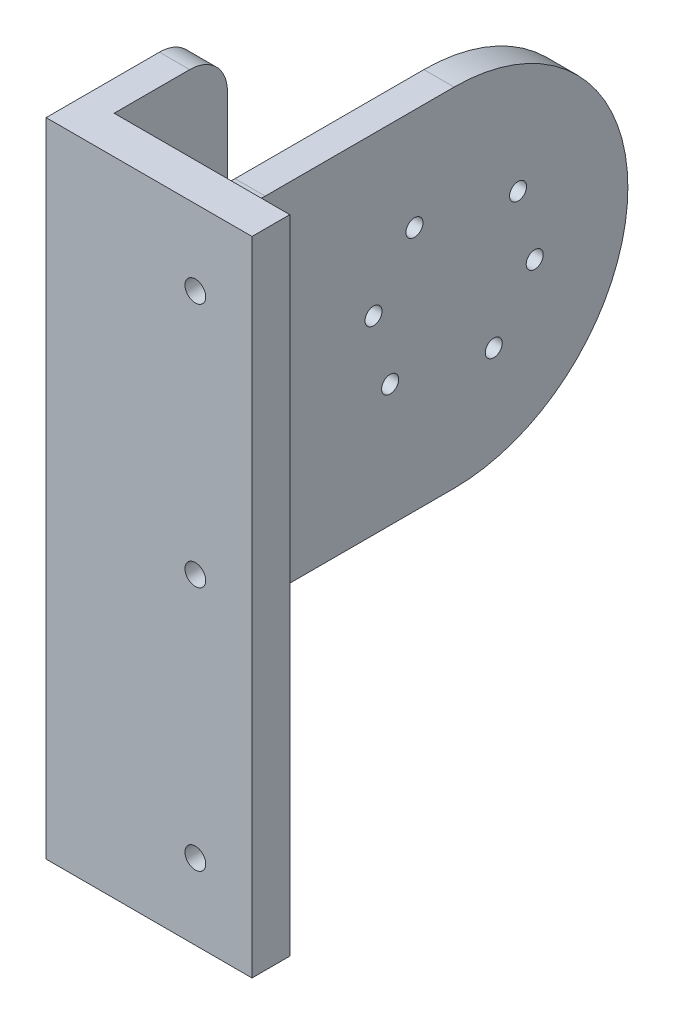
ISO-10303-21;
HEADER;
FILE_DESCRIPTION(('STEP AP214'),'2;1');
FILE_NAME('part.step','',(''),(''),'','','');
FILE_SCHEMA(('AUTOMOTIVE_DESIGN { 1 0 10303 214 1 1 1 1 }'));
ENDSEC;
DATA;
#1=APPLICATION_CONTEXT('core data for automotive mechanical design processes');
#2=APPLICATION_PROTOCOL_DEFINITION('international standard','automotive_design',2000,#1);
#3=PRODUCT_CONTEXT('',#1,'mechanical');
#4=PRODUCT('Part','Part','',(#3));
#5=PRODUCT_RELATED_PRODUCT_CATEGORY('part','',(#4));
#6=PRODUCT_DEFINITION_FORMATION('','',#4);
#7=PRODUCT_DEFINITION_CONTEXT('part definition',#1,'design');
#8=PRODUCT_DEFINITION('design','',#6,#7);
#9=PRODUCT_DEFINITION_SHAPE('','',#8);
#10=(LENGTH_UNIT() NAMED_UNIT(*) SI_UNIT(.MILLI.,.METRE.));
#11=(NAMED_UNIT(*) PLANE_ANGLE_UNIT() SI_UNIT($,.RADIAN.));
#12=(NAMED_UNIT(*) SI_UNIT($,.STERADIAN.) SOLID_ANGLE_UNIT());
#13=UNCERTAINTY_MEASURE_WITH_UNIT(LENGTH_MEASURE(1.E-05),#10,'distance_accuracy_value','');
#14=(GEOMETRIC_REPRESENTATION_CONTEXT(3) GLOBAL_UNCERTAINTY_ASSIGNED_CONTEXT((#13)) GLOBAL_UNIT_ASSIGNED_CONTEXT((#10,
#11,#12)) REPRESENTATION_CONTEXT('',''));
#15=CARTESIAN_POINT('',(0.,0.,0.));
#16=DIRECTION('',(0.,0.,1.));
#17=DIRECTION('',(1.,0.,0.));
#18=AXIS2_PLACEMENT_3D('',#15,#16,#17);
#19=CARTESIAN_POINT('',(7.99999999999997,170.,-10.));
#20=DIRECTION('',(-1.,0.,0.));
#21=DIRECTION('',(0.,0.,-1.));
#22=AXIS2_PLACEMENT_3D('',#19,#20,#21);
#23=PLANE('',#22);
#24=CARTESIAN_POINT('',(7.99999999999997,65.9513128427478,-110.498095902836));
#25=DIRECTION('',(1.,0.,0.));
#26=DIRECTION('',(0.,0.,-1.));
#27=AXIS2_PLACEMENT_3D('',#24,#25,#26);
#28=CIRCLE('',#27,2.25);
#29=CARTESIAN_POINT('',(7.99999999999997,65.9513128427478,-112.748095902836));
#30=VERTEX_POINT('',#29);
#31=EDGE_CURVE('E371',#30,#30,#28,.T.);
#32=ORIENTED_EDGE('',*,*,#31,.F.);
#33=EDGE_LOOP('',(#32));
#34=FACE_BOUND('',#33,.T.);
#35=CARTESIAN_POINT('',(7.99999999999997,98.6463760487826,-116.936319574666));
#36=DIRECTION('',(1.,0.,0.));
#37=DIRECTION('',(0.,0.,-1.));
#38=AXIS2_PLACEMENT_3D('',#35,#36,#37);
#39=CIRCLE('',#38,2.25);
#40=CARTESIAN_POINT('',(7.99999999999997,98.6463760487826,-119.186319574666));
#41=VERTEX_POINT('',#40);
#42=EDGE_CURVE('E375',#41,#41,#39,.T.);
#43=ORIENTED_EDGE('',*,*,#42,.F.);
#44=EDGE_LOOP('',(#43));
#45=FACE_BOUND('',#44,.T.);
#46=CARTESIAN_POINT('',(7.99999999999997,89.2022520557794,-78.6598130828313));
#47=DIRECTION('',(1.,0.,0.));
#48=DIRECTION('',(0.,0.,-1.));
#49=AXIS2_PLACEMENT_3D('',#46,#47,#48);
#50=CIRCLE('',#49,2.25);
#51=CARTESIAN_POINT('',(7.99999999999997,89.2022520557794,-80.9098130828313));
#52=VERTEX_POINT('',#51);
#53=EDGE_CURVE('E382',#52,#52,#50,.T.);
#54=ORIENTED_EDGE('',*,*,#53,.F.);
#55=EDGE_LOOP('',(#54));
#56=FACE_BOUND('',#55,.T.);
#57=CARTESIAN_POINT('',(7.99999999999997,104.048687157252,-89.5019040971644));
#58=DIRECTION('',(1.,0.,0.));
#59=DIRECTION('',(0.,0.,-1.));
#60=AXIS2_PLACEMENT_3D('',#57,#58,#59);
#61=CIRCLE('',#60,2.25);
#62=CARTESIAN_POINT('',(7.99999999999997,104.048687157252,-91.7519040971644));
#63=VERTEX_POINT('',#62);
#64=EDGE_CURVE('E385',#63,#63,#61,.T.);
#65=ORIENTED_EDGE('',*,*,#64,.F.);
#66=EDGE_LOOP('',(#65));
#67=FACE_BOUND('',#66,.T.);
#68=CARTESIAN_POINT('',(7.99999999999997,71.3536239512173,-83.0636804253341));
#69=DIRECTION('',(1.,0.,0.));
#70=DIRECTION('',(0.,0.,-1.));
#71=AXIS2_PLACEMENT_3D('',#68,#69,#70);
#72=CIRCLE('',#71,2.25);
#73=CARTESIAN_POINT('',(7.99999999999997,71.3536239512173,-85.3136804253341));
#74=VERTEX_POINT('',#73);
#75=EDGE_CURVE('E388',#74,#74,#72,.T.);
#76=ORIENTED_EDGE('',*,*,#75,.F.);
#77=EDGE_LOOP('',(#76));
#78=FACE_BOUND('',#77,.T.);
#79=CARTESIAN_POINT('',(7.99999999999997,80.7977479442206,-121.340186917169));
#80=DIRECTION('',(1.,0.,0.));
#81=DIRECTION('',(0.,0.,-1.));
#82=AXIS2_PLACEMENT_3D('',#79,#80,#81);
#83=CIRCLE('',#82,2.25000000000001);
#84=CARTESIAN_POINT('',(7.99999999999997,80.7977479442206,-123.590186917169));
#85=VERTEX_POINT('',#84);
#86=EDGE_CURVE('E391',#85,#85,#83,.T.);
#87=ORIENTED_EDGE('',*,*,#86,.F.);
#88=EDGE_LOOP('',(#87));
#89=FACE_BOUND('',#88,.T.);
#90=DIRECTION('',(0.,1.,0.));
#91=VECTOR('',#90,1.);
#92=CARTESIAN_POINT('',(7.99999999999997,39.,-40.));
#93=LINE('',#92,#91);
#94=CARTESIAN_POINT('',(7.99999999999997,10.,-40.));
#95=VERTEX_POINT('',#94);
#96=CARTESIAN_POINT('',(7.99999999999997,29.,-40.));
#97=VERTEX_POINT('',#96);
#98=EDGE_CURVE('E175',#95,#97,#93,.T.);
#99=ORIENTED_EDGE('',*,*,#98,.T.);
#100=CARTESIAN_POINT('',(7.99999999999998,29.,-50.));
#101=DIRECTION('',(1.,0.,0.));
#102=DIRECTION('',(0.,0.,-1.));
#103=AXIS2_PLACEMENT_3D('',#100,#101,#102);
#104=CIRCLE('',#103,10.);
#105=CARTESIAN_POINT('',(7.99999999999997,39.,-50.));
#106=VERTEX_POINT('',#105);
#107=EDGE_CURVE('E250',#106,#97,#104,.T.);
#108=ORIENTED_EDGE('',*,*,#107,.F.);
#109=DIRECTION('',(0.,0.,-1.));
#110=VECTOR('',#109,1.);
#111=CARTESIAN_POINT('',(7.99999999999998,39.,-100.));
#112=LINE('',#111,#110);
#113=CARTESIAN_POINT('',(7.99999999999998,39.,-100.));
#114=VERTEX_POINT('',#113);
#115=EDGE_CURVE('E178',#106,#114,#112,.T.);
#116=ORIENTED_EDGE('',*,*,#115,.T.);
#117=CARTESIAN_POINT('',(7.99999999999998,85.,-100.));
#118=DIRECTION('',(1.,0.,0.));
#119=DIRECTION('',(0.,0.,1.));
#120=AXIS2_PLACEMENT_3D('',#117,#118,#119);
#121=CIRCLE('',#120,46.);
#122=CARTESIAN_POINT('',(7.99999999999998,131.,-100.));
#123=VERTEX_POINT('',#122);
#124=EDGE_CURVE('E180',#114,#123,#121,.T.);
#125=ORIENTED_EDGE('',*,*,#124,.T.);
#126=DIRECTION('',(0.,0.,1.));
#127=VECTOR('',#126,1.);
#128=CARTESIAN_POINT('',(7.99999999999998,131.,-100.));
#129=LINE('',#128,#127);
#130=CARTESIAN_POINT('',(7.99999999999997,131.,-50.));
#131=VERTEX_POINT('',#130);
#132=EDGE_CURVE('E176',#123,#131,#129,.T.);
#133=ORIENTED_EDGE('',*,*,#132,.T.);
#134=CARTESIAN_POINT('',(7.99999999999998,141.,-50.));
#135=DIRECTION('',(1.,0.,0.));
#136=DIRECTION('',(0.,0.,-1.));
#137=AXIS2_PLACEMENT_3D('',#134,#135,#136);
#138=CIRCLE('',#137,10.);
#139=CARTESIAN_POINT('',(7.99999999999997,141.,-40.));
#140=VERTEX_POINT('',#139);
#141=EDGE_CURVE('E47',#140,#131,#138,.T.);
#142=ORIENTED_EDGE('',*,*,#141,.F.);
#143=DIRECTION('',(0.,1.,0.));
#144=VECTOR('',#143,1.);
#145=CARTESIAN_POINT('',(7.99999999999997,131.,-40.));
#146=LINE('',#145,#144);
#147=CARTESIAN_POINT('',(7.99999999999997,160.,-40.));
#148=VERTEX_POINT('',#147);
#149=EDGE_CURVE('E153',#140,#148,#146,.T.);
#150=ORIENTED_EDGE('',*,*,#149,.T.);
#151=CARTESIAN_POINT('',(7.99999999999998,160.,-30.));
#152=DIRECTION('',(1.,0.,0.));
#153=DIRECTION('',(0.,0.,-1.));
#154=AXIS2_PLACEMENT_3D('',#151,#152,#153);
#155=CIRCLE('',#154,10.);
#156=CARTESIAN_POINT('',(7.99999999999997,170.,-30.));
#157=VERTEX_POINT('',#156);
#158=EDGE_CURVE('E164',#157,#148,#155,.F.);
#159=ORIENTED_EDGE('',*,*,#158,.F.);
#160=DIRECTION('',(0.,0.,1.));
#161=VECTOR('',#160,1.);
#162=CARTESIAN_POINT('',(7.99999999999997,170.,-10.));
#163=LINE('',#162,#161);
#164=CARTESIAN_POINT('',(7.99999999999997,170.,-10.));
#165=VERTEX_POINT('',#164);
#166=EDGE_CURVE('E211',#157,#165,#163,.T.);
#167=ORIENTED_EDGE('',*,*,#166,.T.);
#168=DIRECTION('',(0.,-1.,0.));
#169=VECTOR('',#168,1.);
#170=CARTESIAN_POINT('',(7.99999999999997,0.,-10.));
#171=LINE('',#170,#169);
#172=CARTESIAN_POINT('',(7.99999999999997,0.,-10.));
#173=VERTEX_POINT('',#172);
#174=EDGE_CURVE('E233',#165,#173,#171,.T.);
#175=ORIENTED_EDGE('',*,*,#174,.T.);
#176=DIRECTION('',(0.,0.,1.));
#177=VECTOR('',#176,1.);
#178=CARTESIAN_POINT('',(7.99999999999997,0.,-10.));
#179=LINE('',#178,#177);
#180=CARTESIAN_POINT('',(7.99999999999997,0.,-30.));
#181=VERTEX_POINT('',#180);
#182=EDGE_CURVE('E208',#181,#173,#179,.T.);
#183=ORIENTED_EDGE('',*,*,#182,.F.);
#184=CARTESIAN_POINT('',(7.99999999999997,10.,-30.));
#185=DIRECTION('',(1.,0.,0.));
#186=DIRECTION('',(0.,0.,-1.));
#187=AXIS2_PLACEMENT_3D('',#184,#185,#186);
#188=CIRCLE('',#187,10.);
#189=EDGE_CURVE('E169',#95,#181,#188,.F.);
#190=ORIENTED_EDGE('',*,*,#189,.F.);
#191=EDGE_LOOP('',(#99,#108,#116,#125,#133,#142,#150,#159,#167,#175,#183,#190));
#192=FACE_BOUND('',#191,.T.);
#193=ADVANCED_FACE('F37',(#34,#45,#56,#67,#78,#89,#192),#23,.F.);
#194=CARTESIAN_POINT('',(0.,170.,0.));
#195=DIRECTION('',(0.,0.,-1.));
#196=DIRECTION('',(1.,0.,0.));
#197=AXIS2_PLACEMENT_3D('',#194,#195,#196);
#198=PLANE('',#197);
#199=CARTESIAN_POINT('',(39.5,150.,0.));
#200=DIRECTION('',(0.,0.,-1.));
#201=DIRECTION('',(-1.,0.,0.));
#202=AXIS2_PLACEMENT_3D('',#199,#200,#201);
#203=CIRCLE('',#202,2.75000000000001);
#204=CARTESIAN_POINT('',(36.75,150.,0.));
#205=VERTEX_POINT('',#204);
#206=EDGE_CURVE('E227',#205,#205,#203,.T.);
#207=ORIENTED_EDGE('',*,*,#206,.T.);
#208=EDGE_LOOP('',(#207));
#209=FACE_BOUND('',#208,.T.);
#210=CARTESIAN_POINT('',(39.5,20.,0.));
#211=DIRECTION('',(0.,0.,-1.));
#212=DIRECTION('',(-1.,0.,0.));
#213=AXIS2_PLACEMENT_3D('',#210,#211,#212);
#214=CIRCLE('',#213,2.75000000000001);
#215=CARTESIAN_POINT('',(36.75,20.,0.));
#216=VERTEX_POINT('',#215);
#217=EDGE_CURVE('E370',#216,#216,#214,.T.);
#218=ORIENTED_EDGE('',*,*,#217,.T.);
#219=EDGE_LOOP('',(#218));
#220=FACE_BOUND('',#219,.T.);
#221=CARTESIAN_POINT('',(39.5,85.,0.));
#222=DIRECTION('',(0.,0.,-1.));
#223=DIRECTION('',(-1.,0.,0.));
#224=AXIS2_PLACEMENT_3D('',#221,#222,#223);
#225=CIRCLE('',#224,2.75000000000001);
#226=CARTESIAN_POINT('',(36.75,85.,0.));
#227=VERTEX_POINT('',#226);
#228=EDGE_CURVE('E366',#227,#227,#225,.T.);
#229=ORIENTED_EDGE('',*,*,#228,.T.);
#230=EDGE_LOOP('',(#229));
#231=FACE_BOUND('',#230,.T.);
#232=DIRECTION('',(-1.,0.,0.));
#233=VECTOR('',#232,1.);
#234=CARTESIAN_POINT('',(0.,0.,0.));
#235=LINE('',#234,#233);
#236=CARTESIAN_POINT('',(54.5,0.,0.));
#237=VERTEX_POINT('',#236);
#238=CARTESIAN_POINT('',(0.,0.,0.));
#239=VERTEX_POINT('',#238);
#240=EDGE_CURVE('E203',#237,#239,#235,.T.);
#241=ORIENTED_EDGE('',*,*,#240,.F.);
#242=DIRECTION('',(0.,1.,0.));
#243=VECTOR('',#242,1.);
#244=CARTESIAN_POINT('',(54.5,170.,0.));
#245=LINE('',#244,#243);
#246=CARTESIAN_POINT('',(54.5,170.,0.));
#247=VERTEX_POINT('',#246);
#248=EDGE_CURVE('E255',#237,#247,#245,.T.);
#249=ORIENTED_EDGE('',*,*,#248,.T.);
#250=DIRECTION('',(-1.,0.,0.));
#251=VECTOR('',#250,1.);
#252=CARTESIAN_POINT('',(0.,170.,0.));
#253=LINE('',#252,#251);
#254=CARTESIAN_POINT('',(0.,170.,0.));
#255=VERTEX_POINT('',#254);
#256=EDGE_CURVE('E204',#247,#255,#253,.T.);
#257=ORIENTED_EDGE('',*,*,#256,.T.);
#258=DIRECTION('',(0.,-1.,0.));
#259=VECTOR('',#258,1.);
#260=CARTESIAN_POINT('',(0.,170.,0.));
#261=LINE('',#260,#259);
#262=EDGE_CURVE('E213',#255,#239,#261,.T.);
#263=ORIENTED_EDGE('',*,*,#262,.T.);
#264=EDGE_LOOP('',(#241,#249,#257,#263));
#265=FACE_BOUND('',#264,.T.);
#266=ADVANCED_FACE('F265',(#209,#220,#231,#265),#198,.F.);
#267=CARTESIAN_POINT('',(0.,170.,-300.));
#268=DIRECTION('',(1.,0.,0.));
#269=DIRECTION('',(0.,0.,1.));
#270=AXIS2_PLACEMENT_3D('',#267,#268,#269);
#271=PLANE('',#270);
#272=CARTESIAN_POINT('',(0.,65.9513128427478,-110.498095902836));
#273=DIRECTION('',(1.,0.,0.));
#274=DIRECTION('',(0.,0.,1.));
#275=AXIS2_PLACEMENT_3D('',#272,#273,#274);
#276=CIRCLE('',#275,2.25);
#277=CARTESIAN_POINT('',(0.,65.9513128427478,-108.248095902836));
#278=VERTEX_POINT('',#277);
#279=EDGE_CURVE('E398',#278,#278,#276,.T.);
#280=ORIENTED_EDGE('',*,*,#279,.T.);
#281=EDGE_LOOP('',(#280));
#282=FACE_BOUND('',#281,.T.);
#283=CARTESIAN_POINT('',(0.,98.6463760487826,-116.936319574666));
#284=DIRECTION('',(1.,0.,0.));
#285=DIRECTION('',(0.,0.,-1.));
#286=AXIS2_PLACEMENT_3D('',#283,#284,#285);
#287=CIRCLE('',#286,2.25);
#288=CARTESIAN_POINT('',(0.,98.6463760487826,-119.186319574666));
#289=VERTEX_POINT('',#288);
#290=EDGE_CURVE('E397',#289,#289,#287,.T.);
#291=ORIENTED_EDGE('',*,*,#290,.T.);
#292=EDGE_LOOP('',(#291));
#293=FACE_BOUND('',#292,.T.);
#294=CARTESIAN_POINT('',(0.,89.2022520557794,-78.6598130828313));
#295=DIRECTION('',(1.,0.,0.));
#296=DIRECTION('',(0.,0.,1.));
#297=AXIS2_PLACEMENT_3D('',#294,#295,#296);
#298=CIRCLE('',#297,2.25);
#299=CARTESIAN_POINT('',(0.,89.2022520557794,-76.4098130828313));
#300=VERTEX_POINT('',#299);
#301=EDGE_CURVE('E402',#300,#300,#298,.T.);
#302=ORIENTED_EDGE('',*,*,#301,.T.);
#303=EDGE_LOOP('',(#302));
#304=FACE_BOUND('',#303,.T.);
#305=CARTESIAN_POINT('',(0.,104.048687157252,-89.5019040971644));
#306=DIRECTION('',(1.,0.,0.));
#307=DIRECTION('',(0.,0.,1.));
#308=AXIS2_PLACEMENT_3D('',#305,#306,#307);
#309=CIRCLE('',#308,2.25);
#310=CARTESIAN_POINT('',(0.,104.048687157252,-87.2519040971644));
#311=VERTEX_POINT('',#310);
#312=EDGE_CURVE('E405',#311,#311,#309,.T.);
#313=ORIENTED_EDGE('',*,*,#312,.T.);
#314=EDGE_LOOP('',(#313));
#315=FACE_BOUND('',#314,.T.);
#316=CARTESIAN_POINT('',(0.,71.3536239512173,-83.0636804253341));
#317=DIRECTION('',(1.,0.,0.));
#318=DIRECTION('',(0.,0.,-1.));
#319=AXIS2_PLACEMENT_3D('',#316,#317,#318);
#320=CIRCLE('',#319,2.25);
#321=CARTESIAN_POINT('',(0.,71.3536239512173,-85.3136804253341));
#322=VERTEX_POINT('',#321);
#323=EDGE_CURVE('E401',#322,#322,#320,.T.);
#324=ORIENTED_EDGE('',*,*,#323,.T.);
#325=EDGE_LOOP('',(#324));
#326=FACE_BOUND('',#325,.T.);
#327=CARTESIAN_POINT('',(0.,80.7977479442206,-121.340186917169));
#328=DIRECTION('',(1.,0.,0.));
#329=DIRECTION('',(0.,0.,-1.));
#330=AXIS2_PLACEMENT_3D('',#327,#328,#329);
#331=CIRCLE('',#330,2.25000000000001);
#332=CARTESIAN_POINT('',(0.,80.7977479442206,-123.590186917169));
#333=VERTEX_POINT('',#332);
#334=EDGE_CURVE('E394',#333,#333,#331,.T.);
#335=ORIENTED_EDGE('',*,*,#334,.T.);
#336=EDGE_LOOP('',(#335));
#337=FACE_BOUND('',#336,.T.);
#338=DIRECTION('',(0.,0.,-1.));
#339=VECTOR('',#338,1.);
#340=CARTESIAN_POINT('',(0.,0.,-300.));
#341=LINE('',#340,#339);
#342=CARTESIAN_POINT('',(0.,0.,-30.));
#343=VERTEX_POINT('',#342);
#344=EDGE_CURVE('E216',#239,#343,#341,.T.);
#345=ORIENTED_EDGE('',*,*,#344,.F.);
#346=ORIENTED_EDGE('',*,*,#262,.F.);
#347=DIRECTION('',(0.,0.,-1.));
#348=VECTOR('',#347,1.);
#349=CARTESIAN_POINT('',(0.,170.,-300.));
#350=LINE('',#349,#348);
#351=CARTESIAN_POINT('',(0.,170.,-30.));
#352=VERTEX_POINT('',#351);
#353=EDGE_CURVE('E207',#255,#352,#350,.T.);
#354=ORIENTED_EDGE('',*,*,#353,.T.);
#355=CARTESIAN_POINT('',(0.,160.,-30.));
#356=DIRECTION('',(-1.,0.,0.));
#357=DIRECTION('',(0.,0.,1.));
#358=AXIS2_PLACEMENT_3D('',#355,#356,#357);
#359=CIRCLE('',#358,10.);
#360=CARTESIAN_POINT('',(0.,160.,-40.));
#361=VERTEX_POINT('',#360);
#362=EDGE_CURVE('E235',#361,#352,#359,.F.);
#363=ORIENTED_EDGE('',*,*,#362,.F.);
#364=DIRECTION('',(0.,1.,0.));
#365=VECTOR('',#364,1.);
#366=CARTESIAN_POINT('',(0.,170.,-40.));
#367=LINE('',#366,#365);
#368=CARTESIAN_POINT('',(0.,141.,-40.));
#369=VERTEX_POINT('',#368);
#370=EDGE_CURVE('E156',#369,#361,#367,.T.);
#371=ORIENTED_EDGE('',*,*,#370,.F.);
#372=CARTESIAN_POINT('',(0.,141.,-50.));
#373=DIRECTION('',(-1.,0.,0.));
#374=DIRECTION('',(0.,0.,1.));
#375=AXIS2_PLACEMENT_3D('',#372,#373,#374);
#376=CIRCLE('',#375,10.);
#377=CARTESIAN_POINT('',(0.,131.,-50.));
#378=VERTEX_POINT('',#377);
#379=EDGE_CURVE('E11',#378,#369,#376,.T.);
#380=ORIENTED_EDGE('',*,*,#379,.F.);
#381=DIRECTION('',(0.,0.,1.));
#382=VECTOR('',#381,1.);
#383=CARTESIAN_POINT('',(0.,131.,-300.));
#384=LINE('',#383,#382);
#385=CARTESIAN_POINT('',(0.,131.,-100.));
#386=VERTEX_POINT('',#385);
#387=EDGE_CURVE('E194',#386,#378,#384,.T.);
#388=ORIENTED_EDGE('',*,*,#387,.F.);
#389=CARTESIAN_POINT('',(0.,85.,-100.));
#390=DIRECTION('',(-1.,0.,0.));
#391=DIRECTION('',(0.,0.,1.));
#392=AXIS2_PLACEMENT_3D('',#389,#390,#391);
#393=CIRCLE('',#392,46.);
#394=CARTESIAN_POINT('',(0.,39.,-100.));
#395=VERTEX_POINT('',#394);
#396=EDGE_CURVE('E200',#395,#386,#393,.F.);
#397=ORIENTED_EDGE('',*,*,#396,.F.);
#398=DIRECTION('',(0.,0.,-1.));
#399=VECTOR('',#398,1.);
#400=CARTESIAN_POINT('',(0.,39.,-300.));
#401=LINE('',#400,#399);
#402=CARTESIAN_POINT('',(0.,39.,-50.));
#403=VERTEX_POINT('',#402);
#404=EDGE_CURVE('E197',#403,#395,#401,.T.);
#405=ORIENTED_EDGE('',*,*,#404,.F.);
#406=CARTESIAN_POINT('',(0.,29.,-50.));
#407=DIRECTION('',(-1.,0.,0.));
#408=DIRECTION('',(0.,0.,1.));
#409=AXIS2_PLACEMENT_3D('',#406,#407,#408);
#410=CIRCLE('',#409,10.);
#411=CARTESIAN_POINT('',(0.,29.,-40.));
#412=VERTEX_POINT('',#411);
#413=EDGE_CURVE('E252',#412,#403,#410,.T.);
#414=ORIENTED_EDGE('',*,*,#413,.F.);
#415=DIRECTION('',(0.,1.,0.));
#416=VECTOR('',#415,1.);
#417=CARTESIAN_POINT('',(0.,170.,-40.));
#418=LINE('',#417,#416);
#419=CARTESIAN_POINT('',(0.,10.,-40.));
#420=VERTEX_POINT('',#419);
#421=EDGE_CURVE('E189',#420,#412,#418,.T.);
#422=ORIENTED_EDGE('',*,*,#421,.F.);
#423=CARTESIAN_POINT('',(0.,10.,-30.));
#424=DIRECTION('',(-1.,0.,0.));
#425=DIRECTION('',(0.,0.,1.));
#426=AXIS2_PLACEMENT_3D('',#423,#424,#425);
#427=CIRCLE('',#426,10.);
#428=EDGE_CURVE('E237',#343,#420,#427,.F.);
#429=ORIENTED_EDGE('',*,*,#428,.F.);
#430=EDGE_LOOP('',(#345,#346,#354,#363,#371,#380,#388,#397,#405,#414,#422,#429));
#431=FACE_BOUND('',#430,.T.);
#432=ADVANCED_FACE('F288',(#282,#293,#304,#315,#326,#337,#431),#271,.F.);
#433=CARTESIAN_POINT('',(0.,170.,0.));
#434=DIRECTION('',(0.,1.,0.));
#435=DIRECTION('',(0.,0.,-1.));
#436=AXIS2_PLACEMENT_3D('',#433,#434,#435);
#437=PLANE('',#436);
#438=ORIENTED_EDGE('',*,*,#353,.F.);
#439=ORIENTED_EDGE('',*,*,#256,.F.);
#440=DIRECTION('',(0.,0.,-1.));
#441=VECTOR('',#440,1.);
#442=CARTESIAN_POINT('',(54.5,170.,0.));
#443=LINE('',#442,#441);
#444=CARTESIAN_POINT('',(54.5,170.,-10.));
#445=VERTEX_POINT('',#444);
#446=EDGE_CURVE('E41',#247,#445,#443,.T.);
#447=ORIENTED_EDGE('',*,*,#446,.T.);
#448=DIRECTION('',(-1.,0.,0.));
#449=VECTOR('',#448,1.);
#450=CARTESIAN_POINT('',(64.5,170.,-10.));
#451=LINE('',#450,#449);
#452=EDGE_CURVE('E261',#445,#165,#451,.T.);
#453=ORIENTED_EDGE('',*,*,#452,.T.);
#454=ORIENTED_EDGE('',*,*,#166,.F.);
#455=DIRECTION('',(-1.,0.,0.));
#456=VECTOR('',#455,1.);
#457=CARTESIAN_POINT('',(7.99999999999998,170.,-30.));
#458=LINE('',#457,#456);
#459=EDGE_CURVE('E160',#352,#157,#458,.F.);
#460=ORIENTED_EDGE('',*,*,#459,.F.);
#461=EDGE_LOOP('',(#438,#439,#447,#453,#454,#460));
#462=FACE_BOUND('',#461,.T.);
#463=ADVANCED_FACE('F260',(#462),#437,.T.);
#464=CARTESIAN_POINT('',(0.,0.,0.));
#465=DIRECTION('',(0.,1.,0.));
#466=DIRECTION('',(0.,0.,-1.));
#467=AXIS2_PLACEMENT_3D('',#464,#465,#466);
#468=PLANE('',#467);
#469=ORIENTED_EDGE('',*,*,#182,.T.);
#470=DIRECTION('',(-1.,0.,0.));
#471=VECTOR('',#470,1.);
#472=CARTESIAN_POINT('',(64.5,0.,-10.));
#473=LINE('',#472,#471);
#474=CARTESIAN_POINT('',(54.5,0.,-10.));
#475=VERTEX_POINT('',#474);
#476=EDGE_CURVE('E85',#475,#173,#473,.T.);
#477=ORIENTED_EDGE('',*,*,#476,.F.);
#478=DIRECTION('',(0.,0.,1.));
#479=VECTOR('',#478,1.);
#480=CARTESIAN_POINT('',(54.5,0.,0.));
#481=LINE('',#480,#479);
#482=EDGE_CURVE('E258',#475,#237,#481,.T.);
#483=ORIENTED_EDGE('',*,*,#482,.T.);
#484=ORIENTED_EDGE('',*,*,#240,.T.);
#485=ORIENTED_EDGE('',*,*,#344,.T.);
#486=DIRECTION('',(-1.,0.,0.));
#487=VECTOR('',#486,1.);
#488=CARTESIAN_POINT('',(0.,0.,-30.));
#489=LINE('',#488,#487);
#490=EDGE_CURVE('E222',#181,#343,#489,.T.);
#491=ORIENTED_EDGE('',*,*,#490,.F.);
#492=EDGE_LOOP('',(#469,#477,#483,#484,#485,#491));
#493=FACE_BOUND('',#492,.T.);
#494=ADVANCED_FACE('F267',(#493),#468,.F.);
#495=CARTESIAN_POINT('',(-172.,85.,-100.));
#496=DIRECTION('',(1.,0.,0.));
#497=DIRECTION('',(0.,0.,1.));
#498=AXIS2_PLACEMENT_3D('',#495,#496,#497);
#499=CYLINDRICAL_SURFACE('',#498,46.);
#500=DIRECTION('',(1.,0.,0.));
#501=VECTOR('',#500,1.);
#502=CARTESIAN_POINT('',(-172.,39.,-100.));
#503=LINE('',#502,#501);
#504=EDGE_CURVE('E187',#395,#114,#503,.T.);
#505=ORIENTED_EDGE('',*,*,#504,.F.);
#506=ORIENTED_EDGE('',*,*,#396,.T.);
#507=DIRECTION('',(1.,0.,0.));
#508=VECTOR('',#507,1.);
#509=CARTESIAN_POINT('',(-172.,131.,-100.));
#510=LINE('',#509,#508);
#511=EDGE_CURVE('E186',#386,#123,#510,.T.);
#512=ORIENTED_EDGE('',*,*,#511,.T.);
#513=ORIENTED_EDGE('',*,*,#124,.F.);
#514=EDGE_LOOP('',(#505,#506,#512,#513));
#515=FACE_BOUND('',#514,.T.);
#516=ADVANCED_FACE('F279',(#515),#499,.T.);
#517=CARTESIAN_POINT('',(-172.,39.,-100.));
#518=DIRECTION('',(0.,1.,0.));
#519=DIRECTION('',(0.,0.,-1.));
#520=AXIS2_PLACEMENT_3D('',#517,#518,#519);
#521=PLANE('',#520);
#522=ORIENTED_EDGE('',*,*,#404,.T.);
#523=ORIENTED_EDGE('',*,*,#504,.T.);
#524=ORIENTED_EDGE('',*,*,#115,.F.);
#525=DIRECTION('',(1.,0.,0.));
#526=VECTOR('',#525,1.);
#527=CARTESIAN_POINT('',(7.99999999999998,39.,-50.));
#528=LINE('',#527,#526);
#529=EDGE_CURVE('E56',#403,#106,#528,.T.);
#530=ORIENTED_EDGE('',*,*,#529,.F.);
#531=EDGE_LOOP('',(#522,#523,#524,#530));
#532=FACE_BOUND('',#531,.T.);
#533=ADVANCED_FACE('F546',(#532),#521,.F.);
#534=CARTESIAN_POINT('',(-172.,131.,-100.));
#535=DIRECTION('',(0.,-1.,0.));
#536=DIRECTION('',(0.,0.,1.));
#537=AXIS2_PLACEMENT_3D('',#534,#535,#536);
#538=PLANE('',#537);
#539=ORIENTED_EDGE('',*,*,#132,.F.);
#540=ORIENTED_EDGE('',*,*,#511,.F.);
#541=ORIENTED_EDGE('',*,*,#387,.T.);
#542=DIRECTION('',(1.,0.,0.));
#543=VECTOR('',#542,1.);
#544=CARTESIAN_POINT('',(0.,131.,-50.));
#545=LINE('',#544,#543);
#546=EDGE_CURVE('E248',#131,#378,#545,.F.);
#547=ORIENTED_EDGE('',*,*,#546,.F.);
#548=EDGE_LOOP('',(#539,#540,#541,#547));
#549=FACE_BOUND('',#548,.T.);
#550=ADVANCED_FACE('F283',(#549),#538,.F.);
#551=CARTESIAN_POINT('',(-172.,131.,-40.));
#552=DIRECTION('',(0.,0.,1.));
#553=DIRECTION('',(0.,1.,0.));
#554=AXIS2_PLACEMENT_3D('',#551,#552,#553);
#555=PLANE('',#554);
#556=ORIENTED_EDGE('',*,*,#149,.F.);
#557=DIRECTION('',(1.,0.,0.));
#558=VECTOR('',#557,1.);
#559=CARTESIAN_POINT('',(7.99999999999998,141.,-40.));
#560=LINE('',#559,#558);
#561=EDGE_CURVE('E161',#369,#140,#560,.T.);
#562=ORIENTED_EDGE('',*,*,#561,.F.);
#563=ORIENTED_EDGE('',*,*,#370,.T.);
#564=DIRECTION('',(-1.,0.,0.));
#565=VECTOR('',#564,1.);
#566=CARTESIAN_POINT('',(0.,160.,-40.));
#567=LINE('',#566,#565);
#568=EDGE_CURVE('E149',#148,#361,#567,.T.);
#569=ORIENTED_EDGE('',*,*,#568,.F.);
#570=EDGE_LOOP('',(#556,#562,#563,#569));
#571=FACE_BOUND('',#570,.T.);
#572=ADVANCED_FACE('F151',(#571),#555,.F.);
#573=CARTESIAN_POINT('',(-172.,39.,-40.));
#574=DIRECTION('',(0.,0.,1.));
#575=DIRECTION('',(0.,1.,0.));
#576=AXIS2_PLACEMENT_3D('',#573,#574,#575);
#577=PLANE('',#576);
#578=ORIENTED_EDGE('',*,*,#421,.T.);
#579=DIRECTION('',(1.,0.,0.));
#580=VECTOR('',#579,1.);
#581=CARTESIAN_POINT('',(0.,29.,-40.));
#582=LINE('',#581,#580);
#583=EDGE_CURVE('E240',#97,#412,#582,.F.);
#584=ORIENTED_EDGE('',*,*,#583,.F.);
#585=ORIENTED_EDGE('',*,*,#98,.F.);
#586=DIRECTION('',(-1.,0.,0.));
#587=VECTOR('',#586,1.);
#588=CARTESIAN_POINT('',(-172.,10.,-40.0000000000001));
#589=LINE('',#588,#587);
#590=EDGE_CURVE('E170',#420,#95,#589,.F.);
#591=ORIENTED_EDGE('',*,*,#590,.F.);
#592=EDGE_LOOP('',(#578,#584,#585,#591));
#593=FACE_BOUND('',#592,.T.);
#594=ADVANCED_FACE('F296',(#593),#577,.F.);
#595=CARTESIAN_POINT('',(64.5,0.,-10.));
#596=DIRECTION('',(0.,0.,1.));
#597=DIRECTION('',(-1.,0.,0.));
#598=AXIS2_PLACEMENT_3D('',#595,#596,#597);
#599=PLANE('',#598);
#600=CARTESIAN_POINT('',(39.5,150.,-10.));
#601=DIRECTION('',(0.,0.,-1.));
#602=DIRECTION('',(-1.,0.,0.));
#603=AXIS2_PLACEMENT_3D('',#600,#601,#602);
#604=CIRCLE('',#603,2.75000000000001);
#605=CARTESIAN_POINT('',(36.75,150.,-10.));
#606=VERTEX_POINT('',#605);
#607=EDGE_CURVE('E230',#606,#606,#604,.T.);
#608=ORIENTED_EDGE('',*,*,#607,.F.);
#609=EDGE_LOOP('',(#608));
#610=FACE_BOUND('',#609,.T.);
#611=CARTESIAN_POINT('',(39.5,20.,-10.));
#612=DIRECTION('',(0.,0.,-1.));
#613=DIRECTION('',(-1.,0.,0.));
#614=AXIS2_PLACEMENT_3D('',#611,#612,#613);
#615=CIRCLE('',#614,2.75000000000001);
#616=CARTESIAN_POINT('',(36.75,20.,-10.));
#617=VERTEX_POINT('',#616);
#618=EDGE_CURVE('E226',#617,#617,#615,.T.);
#619=ORIENTED_EDGE('',*,*,#618,.F.);
#620=EDGE_LOOP('',(#619));
#621=FACE_BOUND('',#620,.T.);
#622=CARTESIAN_POINT('',(39.5,85.,-10.));
#623=DIRECTION('',(0.,0.,-1.));
#624=DIRECTION('',(-1.,0.,0.));
#625=AXIS2_PLACEMENT_3D('',#622,#623,#624);
#626=CIRCLE('',#625,2.75000000000001);
#627=CARTESIAN_POINT('',(36.75,85.,-10.));
#628=VERTEX_POINT('',#627);
#629=EDGE_CURVE('E223',#628,#628,#626,.T.);
#630=ORIENTED_EDGE('',*,*,#629,.F.);
#631=EDGE_LOOP('',(#630));
#632=FACE_BOUND('',#631,.T.);
#633=ORIENTED_EDGE('',*,*,#174,.F.);
#634=ORIENTED_EDGE('',*,*,#452,.F.);
#635=DIRECTION('',(0.,-1.,0.));
#636=VECTOR('',#635,1.);
#637=CARTESIAN_POINT('',(54.5,0.,-10.));
#638=LINE('',#637,#636);
#639=EDGE_CURVE('E74',#445,#475,#638,.T.);
#640=ORIENTED_EDGE('',*,*,#639,.T.);
#641=ORIENTED_EDGE('',*,*,#476,.T.);
#642=EDGE_LOOP('',(#633,#634,#640,#641));
#643=FACE_BOUND('',#642,.T.);
#644=ADVANCED_FACE('F294',(#610,#621,#632,#643),#599,.F.);
#645=CARTESIAN_POINT('',(54.5,0.,0.));
#646=DIRECTION('',(1.,0.,0.));
#647=DIRECTION('',(0.,0.,1.));
#648=AXIS2_PLACEMENT_3D('',#645,#646,#647);
#649=PLANE('',#648);
#650=ORIENTED_EDGE('',*,*,#248,.F.);
#651=ORIENTED_EDGE('',*,*,#482,.F.);
#652=ORIENTED_EDGE('',*,*,#639,.F.);
#653=ORIENTED_EDGE('',*,*,#446,.F.);
#654=EDGE_LOOP('',(#650,#651,#652,#653));
#655=FACE_BOUND('',#654,.T.);
#656=ADVANCED_FACE('F39',(#655),#649,.T.);
#657=CARTESIAN_POINT('',(39.5,85.,-52.));
#658=DIRECTION('',(0.,0.,1.));
#659=DIRECTION('',(-1.,0.,0.));
#660=AXIS2_PLACEMENT_3D('',#657,#658,#659);
#661=CYLINDRICAL_SURFACE('',#660,2.75000000000001);
#662=CARTESIAN_POINT('',(36.75,85.,0.));
#663=CARTESIAN_POINT('',(36.75,85.,-0.10416666666666));
#664=CARTESIAN_POINT('',(36.75,85.,-0.208333333333327));
#665=CARTESIAN_POINT('',(36.75,85.,-0.41666666666666));
#666=CARTESIAN_POINT('',(36.75,85.,-0.520833333333327));
#667=CARTESIAN_POINT('',(36.75,85.,-0.72916666666666));
#668=CARTESIAN_POINT('',(36.75,85.,-0.833333333333327));
#669=CARTESIAN_POINT('',(36.75,85.,-1.04166666666666));
#670=CARTESIAN_POINT('',(36.75,85.,-1.14583333333333));
#671=CARTESIAN_POINT('',(36.75,85.,-1.35416666666666));
#672=CARTESIAN_POINT('',(36.75,85.,-1.45833333333333));
#673=CARTESIAN_POINT('',(36.75,85.,-1.66666666666666));
#674=CARTESIAN_POINT('',(36.75,85.,-1.77083333333333));
#675=CARTESIAN_POINT('',(36.75,85.,-1.97916666666666));
#676=CARTESIAN_POINT('',(36.75,85.,-2.08333333333333));
#677=CARTESIAN_POINT('',(36.75,85.,-2.29166666666666));
#678=CARTESIAN_POINT('',(36.75,85.,-2.39583333333333));
#679=CARTESIAN_POINT('',(36.75,85.,-2.60416666666666));
#680=CARTESIAN_POINT('',(36.75,85.,-2.70833333333333));
#681=CARTESIAN_POINT('',(36.75,85.,-2.91666666666666));
#682=CARTESIAN_POINT('',(36.75,85.,-3.02083333333333));
#683=CARTESIAN_POINT('',(36.75,85.,-3.22916666666666));
#684=CARTESIAN_POINT('',(36.75,85.,-3.33333333333333));
#685=CARTESIAN_POINT('',(36.75,85.,-3.54166666666666));
#686=CARTESIAN_POINT('',(36.75,85.,-3.64583333333333));
#687=CARTESIAN_POINT('',(36.75,85.,-3.85416666666666));
#688=CARTESIAN_POINT('',(36.75,85.,-3.95833333333333));
#689=CARTESIAN_POINT('',(36.75,85.,-4.16666666666666));
#690=CARTESIAN_POINT('',(36.75,85.,-4.27083333333333));
#691=CARTESIAN_POINT('',(36.75,85.,-4.47916666666666));
#692=CARTESIAN_POINT('',(36.75,85.,-4.58333333333333));
#693=CARTESIAN_POINT('',(36.75,85.,-4.79166666666666));
#694=CARTESIAN_POINT('',(36.75,85.,-4.89583333333333));
#695=CARTESIAN_POINT('',(36.75,85.,-5.10416666666666));
#696=CARTESIAN_POINT('',(36.75,85.,-5.20833333333333));
#697=CARTESIAN_POINT('',(36.75,85.,-5.41666666666666));
#698=CARTESIAN_POINT('',(36.75,85.,-5.52083333333333));
#699=CARTESIAN_POINT('',(36.75,85.,-5.72916666666666));
#700=CARTESIAN_POINT('',(36.75,85.,-5.83333333333333));
#701=CARTESIAN_POINT('',(36.75,85.,-6.04166666666667));
#702=CARTESIAN_POINT('',(36.75,85.,-6.14583333333333));
#703=CARTESIAN_POINT('',(36.75,85.,-6.35416666666667));
#704=CARTESIAN_POINT('',(36.75,85.,-6.45833333333333));
#705=CARTESIAN_POINT('',(36.75,85.,-6.66666666666667));
#706=CARTESIAN_POINT('',(36.75,85.,-6.77083333333333));
#707=CARTESIAN_POINT('',(36.75,85.,-6.97916666666667));
#708=CARTESIAN_POINT('',(36.75,85.,-7.08333333333333));
#709=CARTESIAN_POINT('',(36.75,85.,-7.29166666666667));
#710=CARTESIAN_POINT('',(36.75,85.,-7.39583333333333));
#711=CARTESIAN_POINT('',(36.75,85.,-7.60416666666667));
#712=CARTESIAN_POINT('',(36.75,85.,-7.70833333333333));
#713=CARTESIAN_POINT('',(36.75,85.,-7.91666666666667));
#714=CARTESIAN_POINT('',(36.75,85.,-8.02083333333333));
#715=CARTESIAN_POINT('',(36.75,85.,-8.22916666666667));
#716=CARTESIAN_POINT('',(36.75,85.,-8.33333333333333));
#717=CARTESIAN_POINT('',(36.75,85.,-8.54166666666667));
#718=CARTESIAN_POINT('',(36.75,85.,-8.64583333333333));
#719=CARTESIAN_POINT('',(36.75,85.,-8.85416666666667));
#720=CARTESIAN_POINT('',(36.75,85.,-8.95833333333333));
#721=CARTESIAN_POINT('',(36.75,85.,-9.16666666666667));
#722=CARTESIAN_POINT('',(36.75,85.,-9.27083333333333));
#723=CARTESIAN_POINT('',(36.75,85.,-9.47916666666667));
#724=CARTESIAN_POINT('',(36.75,85.,-9.58333333333333));
#725=CARTESIAN_POINT('',(36.75,85.,-9.79166666666667));
#726=CARTESIAN_POINT('',(36.75,85.,-9.89583333333333));
#727=CARTESIAN_POINT('',(36.75,85.,-10.));
#728=B_SPLINE_CURVE_WITH_KNOTS('',3,(#662,#663,#664,#665,#666,#667,#668,#669,#670,#671,#672,
#673,#674,#675,#676,#677,#678,#679,#680,#681,#682,#683,#684,#685,#686,#687,#688,#689,#690,#691,
#692,#693,#694,#695,#696,#697,#698,#699,#700,#701,#702,#703,#704,#705,#706,#707,#708,#709,#710,
#711,#712,#713,#714,#715,#716,#717,#718,#719,#720,#721,#722,#723,#724,#725,#726,#727),
.UNSPECIFIED.,.F.,.F.,(4,2,2,2,2,2,2,2,2,2,2,2,2,2,2,2,2,2,2,2,2,2,2,2,2,2,2,2,2,2,2,2,4),(0.,
0.3125,0.625000000000001,0.937500000000001,1.25,1.5625,1.875,2.1875,2.5,2.8125,3.125,3.4375,
3.75,4.0625,4.375,4.6875,5.,5.3125,5.62500000000001,5.93750000000001,6.25000000000001,
6.56250000000001,6.87500000000001,7.18750000000001,7.50000000000001,7.81250000000001,
8.12500000000001,8.43750000000001,8.75000000000001,9.06250000000001,9.37500000000001,
9.68750000000001,10.),.UNSPECIFIED.);
#729=EDGE_CURVE('BSEAM303',#227,#628,#728,.T.);
#730=ORIENTED_EDGE('',*,*,#228,.F.);
#731=ORIENTED_EDGE('',*,*,#629,.T.);
#732=ORIENTED_EDGE('',*,*,#729,.T.);
#733=ORIENTED_EDGE('',*,*,#729,.F.);
#734=EDGE_LOOP('',(#730,#732,#731,#733));
#735=FACE_BOUND('',#734,.T.);
#736=ADVANCED_FACE('F303',(#735),#661,.F.);
#737=CARTESIAN_POINT('',(39.5,20.,-52.));
#738=DIRECTION('',(0.,0.,1.));
#739=DIRECTION('',(-1.,0.,0.));
#740=AXIS2_PLACEMENT_3D('',#737,#738,#739);
#741=CYLINDRICAL_SURFACE('',#740,2.75000000000001);
#742=CARTESIAN_POINT('',(36.75,20.,0.));
#743=CARTESIAN_POINT('',(36.75,20.,-0.10416666666666));
#744=CARTESIAN_POINT('',(36.75,20.,-0.208333333333327));
#745=CARTESIAN_POINT('',(36.75,20.,-0.41666666666666));
#746=CARTESIAN_POINT('',(36.75,20.,-0.520833333333327));
#747=CARTESIAN_POINT('',(36.75,20.,-0.72916666666666));
#748=CARTESIAN_POINT('',(36.75,20.,-0.833333333333327));
#749=CARTESIAN_POINT('',(36.75,20.,-1.04166666666666));
#750=CARTESIAN_POINT('',(36.75,20.,-1.14583333333333));
#751=CARTESIAN_POINT('',(36.75,20.,-1.35416666666666));
#752=CARTESIAN_POINT('',(36.75,20.,-1.45833333333333));
#753=CARTESIAN_POINT('',(36.75,20.,-1.66666666666666));
#754=CARTESIAN_POINT('',(36.75,20.,-1.77083333333333));
#755=CARTESIAN_POINT('',(36.75,20.,-1.97916666666666));
#756=CARTESIAN_POINT('',(36.75,20.,-2.08333333333333));
#757=CARTESIAN_POINT('',(36.75,20.,-2.29166666666666));
#758=CARTESIAN_POINT('',(36.75,20.,-2.39583333333333));
#759=CARTESIAN_POINT('',(36.75,20.,-2.60416666666666));
#760=CARTESIAN_POINT('',(36.75,20.,-2.70833333333333));
#761=CARTESIAN_POINT('',(36.75,20.,-2.91666666666666));
#762=CARTESIAN_POINT('',(36.75,20.,-3.02083333333333));
#763=CARTESIAN_POINT('',(36.75,20.,-3.22916666666666));
#764=CARTESIAN_POINT('',(36.75,20.,-3.33333333333333));
#765=CARTESIAN_POINT('',(36.75,20.,-3.54166666666666));
#766=CARTESIAN_POINT('',(36.75,20.,-3.64583333333333));
#767=CARTESIAN_POINT('',(36.75,20.,-3.85416666666666));
#768=CARTESIAN_POINT('',(36.75,20.,-3.95833333333333));
#769=CARTESIAN_POINT('',(36.75,20.,-4.16666666666666));
#770=CARTESIAN_POINT('',(36.75,20.,-4.27083333333333));
#771=CARTESIAN_POINT('',(36.75,20.,-4.47916666666666));
#772=CARTESIAN_POINT('',(36.75,20.,-4.58333333333333));
#773=CARTESIAN_POINT('',(36.75,20.,-4.79166666666666));
#774=CARTESIAN_POINT('',(36.75,20.,-4.89583333333333));
#775=CARTESIAN_POINT('',(36.75,20.,-5.10416666666666));
#776=CARTESIAN_POINT('',(36.75,20.,-5.20833333333333));
#777=CARTESIAN_POINT('',(36.75,20.,-5.41666666666666));
#778=CARTESIAN_POINT('',(36.75,20.,-5.52083333333333));
#779=CARTESIAN_POINT('',(36.75,20.,-5.72916666666666));
#780=CARTESIAN_POINT('',(36.75,20.,-5.83333333333333));
#781=CARTESIAN_POINT('',(36.75,20.,-6.04166666666667));
#782=CARTESIAN_POINT('',(36.75,20.,-6.14583333333333));
#783=CARTESIAN_POINT('',(36.75,20.,-6.35416666666667));
#784=CARTESIAN_POINT('',(36.75,20.,-6.45833333333333));
#785=CARTESIAN_POINT('',(36.75,20.,-6.66666666666667));
#786=CARTESIAN_POINT('',(36.75,20.,-6.77083333333333));
#787=CARTESIAN_POINT('',(36.75,20.,-6.97916666666667));
#788=CARTESIAN_POINT('',(36.75,20.,-7.08333333333333));
#789=CARTESIAN_POINT('',(36.75,20.,-7.29166666666667));
#790=CARTESIAN_POINT('',(36.75,20.,-7.39583333333333));
#791=CARTESIAN_POINT('',(36.75,20.,-7.60416666666667));
#792=CARTESIAN_POINT('',(36.75,20.,-7.70833333333333));
#793=CARTESIAN_POINT('',(36.75,20.,-7.91666666666667));
#794=CARTESIAN_POINT('',(36.75,20.,-8.02083333333333));
#795=CARTESIAN_POINT('',(36.75,20.,-8.22916666666667));
#796=CARTESIAN_POINT('',(36.75,20.,-8.33333333333333));
#797=CARTESIAN_POINT('',(36.75,20.,-8.54166666666667));
#798=CARTESIAN_POINT('',(36.75,20.,-8.64583333333333));
#799=CARTESIAN_POINT('',(36.75,20.,-8.85416666666667));
#800=CARTESIAN_POINT('',(36.75,20.,-8.95833333333333));
#801=CARTESIAN_POINT('',(36.75,20.,-9.16666666666667));
#802=CARTESIAN_POINT('',(36.75,20.,-9.27083333333333));
#803=CARTESIAN_POINT('',(36.75,20.,-9.47916666666667));
#804=CARTESIAN_POINT('',(36.75,20.,-9.58333333333333));
#805=CARTESIAN_POINT('',(36.75,20.,-9.79166666666667));
#806=CARTESIAN_POINT('',(36.75,20.,-9.89583333333333));
#807=CARTESIAN_POINT('',(36.75,20.,-10.));
#808=B_SPLINE_CURVE_WITH_KNOTS('',3,(#742,#743,#744,#745,#746,#747,#748,#749,#750,#751,#752,
#753,#754,#755,#756,#757,#758,#759,#760,#761,#762,#763,#764,#765,#766,#767,#768,#769,#770,#771,
#772,#773,#774,#775,#776,#777,#778,#779,#780,#781,#782,#783,#784,#785,#786,#787,#788,#789,#790,
#791,#792,#793,#794,#795,#796,#797,#798,#799,#800,#801,#802,#803,#804,#805,#806,#807),
.UNSPECIFIED.,.F.,.F.,(4,2,2,2,2,2,2,2,2,2,2,2,2,2,2,2,2,2,2,2,2,2,2,2,2,2,2,2,2,2,2,2,4),(0.,
0.3125,0.625000000000001,0.937500000000001,1.25,1.5625,1.875,2.1875,2.5,2.8125,3.125,3.4375,
3.75,4.0625,4.375,4.6875,5.,5.3125,5.62500000000001,5.93750000000001,6.25000000000001,
6.56250000000001,6.87500000000001,7.18750000000001,7.50000000000001,7.81250000000001,
8.12500000000001,8.43750000000001,8.75000000000001,9.06250000000001,9.37500000000001,
9.68750000000001,10.),.UNSPECIFIED.);
#809=EDGE_CURVE('BSEAM355',#216,#617,#808,.T.);
#810=ORIENTED_EDGE('',*,*,#217,.F.);
#811=ORIENTED_EDGE('',*,*,#618,.T.);
#812=ORIENTED_EDGE('',*,*,#809,.T.);
#813=ORIENTED_EDGE('',*,*,#809,.F.);
#814=EDGE_LOOP('',(#810,#812,#811,#813));
#815=FACE_BOUND('',#814,.T.);
#816=ADVANCED_FACE('F355',(#815),#741,.F.);
#817=CARTESIAN_POINT('',(39.5,150.,-52.));
#818=DIRECTION('',(0.,0.,1.));
#819=DIRECTION('',(-1.,0.,0.));
#820=AXIS2_PLACEMENT_3D('',#817,#818,#819);
#821=CYLINDRICAL_SURFACE('',#820,2.75000000000001);
#822=CARTESIAN_POINT('',(36.75,150.,0.));
#823=CARTESIAN_POINT('',(36.75,150.,-0.10416666666666));
#824=CARTESIAN_POINT('',(36.75,150.,-0.208333333333327));
#825=CARTESIAN_POINT('',(36.75,150.,-0.41666666666666));
#826=CARTESIAN_POINT('',(36.75,150.,-0.520833333333327));
#827=CARTESIAN_POINT('',(36.75,150.,-0.72916666666666));
#828=CARTESIAN_POINT('',(36.75,150.,-0.833333333333327));
#829=CARTESIAN_POINT('',(36.75,150.,-1.04166666666666));
#830=CARTESIAN_POINT('',(36.75,150.,-1.14583333333333));
#831=CARTESIAN_POINT('',(36.75,150.,-1.35416666666666));
#832=CARTESIAN_POINT('',(36.75,150.,-1.45833333333333));
#833=CARTESIAN_POINT('',(36.75,150.,-1.66666666666666));
#834=CARTESIAN_POINT('',(36.75,150.,-1.77083333333333));
#835=CARTESIAN_POINT('',(36.75,150.,-1.97916666666666));
#836=CARTESIAN_POINT('',(36.75,150.,-2.08333333333333));
#837=CARTESIAN_POINT('',(36.75,150.,-2.29166666666666));
#838=CARTESIAN_POINT('',(36.75,150.,-2.39583333333333));
#839=CARTESIAN_POINT('',(36.75,150.,-2.60416666666666));
#840=CARTESIAN_POINT('',(36.75,150.,-2.70833333333333));
#841=CARTESIAN_POINT('',(36.75,150.,-2.91666666666666));
#842=CARTESIAN_POINT('',(36.75,150.,-3.02083333333333));
#843=CARTESIAN_POINT('',(36.75,150.,-3.22916666666666));
#844=CARTESIAN_POINT('',(36.75,150.,-3.33333333333333));
#845=CARTESIAN_POINT('',(36.75,150.,-3.54166666666666));
#846=CARTESIAN_POINT('',(36.75,150.,-3.64583333333333));
#847=CARTESIAN_POINT('',(36.75,150.,-3.85416666666666));
#848=CARTESIAN_POINT('',(36.75,150.,-3.95833333333333));
#849=CARTESIAN_POINT('',(36.75,150.,-4.16666666666666));
#850=CARTESIAN_POINT('',(36.75,150.,-4.27083333333333));
#851=CARTESIAN_POINT('',(36.75,150.,-4.47916666666666));
#852=CARTESIAN_POINT('',(36.75,150.,-4.58333333333333));
#853=CARTESIAN_POINT('',(36.75,150.,-4.79166666666666));
#854=CARTESIAN_POINT('',(36.75,150.,-4.89583333333333));
#855=CARTESIAN_POINT('',(36.75,150.,-5.10416666666666));
#856=CARTESIAN_POINT('',(36.75,150.,-5.20833333333333));
#857=CARTESIAN_POINT('',(36.75,150.,-5.41666666666666));
#858=CARTESIAN_POINT('',(36.75,150.,-5.52083333333333));
#859=CARTESIAN_POINT('',(36.75,150.,-5.72916666666666));
#860=CARTESIAN_POINT('',(36.75,150.,-5.83333333333333));
#861=CARTESIAN_POINT('',(36.75,150.,-6.04166666666667));
#862=CARTESIAN_POINT('',(36.75,150.,-6.14583333333333));
#863=CARTESIAN_POINT('',(36.75,150.,-6.35416666666667));
#864=CARTESIAN_POINT('',(36.75,150.,-6.45833333333333));
#865=CARTESIAN_POINT('',(36.75,150.,-6.66666666666667));
#866=CARTESIAN_POINT('',(36.75,150.,-6.77083333333333));
#867=CARTESIAN_POINT('',(36.75,150.,-6.97916666666667));
#868=CARTESIAN_POINT('',(36.75,150.,-7.08333333333333));
#869=CARTESIAN_POINT('',(36.75,150.,-7.29166666666667));
#870=CARTESIAN_POINT('',(36.75,150.,-7.39583333333333));
#871=CARTESIAN_POINT('',(36.75,150.,-7.60416666666667));
#872=CARTESIAN_POINT('',(36.75,150.,-7.70833333333333));
#873=CARTESIAN_POINT('',(36.75,150.,-7.91666666666667));
#874=CARTESIAN_POINT('',(36.75,150.,-8.02083333333333));
#875=CARTESIAN_POINT('',(36.75,150.,-8.22916666666667));
#876=CARTESIAN_POINT('',(36.75,150.,-8.33333333333333));
#877=CARTESIAN_POINT('',(36.75,150.,-8.54166666666667));
#878=CARTESIAN_POINT('',(36.75,150.,-8.64583333333333));
#879=CARTESIAN_POINT('',(36.75,150.,-8.85416666666667));
#880=CARTESIAN_POINT('',(36.75,150.,-8.95833333333333));
#881=CARTESIAN_POINT('',(36.75,150.,-9.16666666666667));
#882=CARTESIAN_POINT('',(36.75,150.,-9.27083333333333));
#883=CARTESIAN_POINT('',(36.75,150.,-9.47916666666667));
#884=CARTESIAN_POINT('',(36.75,150.,-9.58333333333333));
#885=CARTESIAN_POINT('',(36.75,150.,-9.79166666666667));
#886=CARTESIAN_POINT('',(36.75,150.,-9.89583333333333));
#887=CARTESIAN_POINT('',(36.75,150.,-10.));
#888=B_SPLINE_CURVE_WITH_KNOTS('',3,(#822,#823,#824,#825,#826,#827,#828,#829,#830,#831,#832,
#833,#834,#835,#836,#837,#838,#839,#840,#841,#842,#843,#844,#845,#846,#847,#848,#849,#850,#851,
#852,#853,#854,#855,#856,#857,#858,#859,#860,#861,#862,#863,#864,#865,#866,#867,#868,#869,#870,
#871,#872,#873,#874,#875,#876,#877,#878,#879,#880,#881,#882,#883,#884,#885,#886,#887),
.UNSPECIFIED.,.F.,.F.,(4,2,2,2,2,2,2,2,2,2,2,2,2,2,2,2,2,2,2,2,2,2,2,2,2,2,2,2,2,2,2,2,4),(0.,
0.3125,0.625000000000001,0.937500000000001,1.25,1.5625,1.875,2.1875,2.5,2.8125,3.125,3.4375,
3.75,4.0625,4.375,4.6875,5.,5.3125,5.62500000000001,5.93750000000001,6.25000000000001,
6.56250000000001,6.87500000000001,7.18750000000001,7.50000000000001,7.81250000000001,
8.12500000000001,8.43750000000001,8.75000000000001,9.06250000000001,9.37500000000001,
9.68750000000001,10.),.UNSPECIFIED.);
#889=EDGE_CURVE('BSEAM329',#205,#606,#888,.T.);
#890=ORIENTED_EDGE('',*,*,#206,.F.);
#891=ORIENTED_EDGE('',*,*,#607,.T.);
#892=ORIENTED_EDGE('',*,*,#889,.T.);
#893=ORIENTED_EDGE('',*,*,#889,.F.);
#894=EDGE_LOOP('',(#890,#892,#891,#893));
#895=FACE_BOUND('',#894,.T.);
#896=ADVANCED_FACE('F329',(#895),#821,.F.);
#897=CARTESIAN_POINT('',(0.,10.,-30.));
#898=DIRECTION('',(-1.,0.,0.));
#899=DIRECTION('',(0.,0.,-1.));
#900=AXIS2_PLACEMENT_3D('',#897,#898,#899);
#901=CYLINDRICAL_SURFACE('',#900,10.);
#902=ORIENTED_EDGE('',*,*,#189,.T.);
#903=ORIENTED_EDGE('',*,*,#490,.T.);
#904=ORIENTED_EDGE('',*,*,#428,.T.);
#905=ORIENTED_EDGE('',*,*,#590,.T.);
#906=EDGE_LOOP('',(#902,#903,#904,#905));
#907=FACE_BOUND('',#906,.T.);
#908=ADVANCED_FACE('F292',(#907),#901,.T.);
#909=CARTESIAN_POINT('',(-172.,29.,-50.));
#910=DIRECTION('',(-1.,0.,0.));
#911=DIRECTION('',(0.,0.,-1.));
#912=AXIS2_PLACEMENT_3D('',#909,#910,#911);
#913=CYLINDRICAL_SURFACE('',#912,10.);
#914=ORIENTED_EDGE('',*,*,#413,.T.);
#915=ORIENTED_EDGE('',*,*,#529,.T.);
#916=ORIENTED_EDGE('',*,*,#107,.T.);
#917=ORIENTED_EDGE('',*,*,#583,.T.);
#918=EDGE_LOOP('',(#914,#915,#916,#917));
#919=FACE_BOUND('',#918,.T.);
#920=ADVANCED_FACE('F328',(#919),#913,.F.);
#921=CARTESIAN_POINT('',(-172.,160.,-30.0000000000001));
#922=DIRECTION('',(1.,0.,0.));
#923=DIRECTION('',(0.,0.,1.));
#924=AXIS2_PLACEMENT_3D('',#921,#922,#923);
#925=CYLINDRICAL_SURFACE('',#924,10.);
#926=ORIENTED_EDGE('',*,*,#158,.T.);
#927=ORIENTED_EDGE('',*,*,#568,.T.);
#928=ORIENTED_EDGE('',*,*,#362,.T.);
#929=ORIENTED_EDGE('',*,*,#459,.T.);
#930=EDGE_LOOP('',(#926,#927,#928,#929));
#931=FACE_BOUND('',#930,.T.);
#932=ADVANCED_FACE('F165',(#931),#925,.T.);
#933=CARTESIAN_POINT('',(-172.,141.,-50.));
#934=DIRECTION('',(-1.,0.,0.));
#935=DIRECTION('',(0.,0.,-1.));
#936=AXIS2_PLACEMENT_3D('',#933,#934,#935);
#937=CYLINDRICAL_SURFACE('',#936,10.);
#938=ORIENTED_EDGE('',*,*,#379,.T.);
#939=ORIENTED_EDGE('',*,*,#561,.T.);
#940=ORIENTED_EDGE('',*,*,#141,.T.);
#941=ORIENTED_EDGE('',*,*,#546,.T.);
#942=EDGE_LOOP('',(#938,#939,#940,#941));
#943=FACE_BOUND('',#942,.T.);
#944=ADVANCED_FACE('F286',(#943),#937,.F.);
#945=CARTESIAN_POINT('',(10.,80.7977479442206,-121.340186917169));
#946=DIRECTION('',(-1.,0.,0.));
#947=DIRECTION('',(0.,0.,-1.));
#948=AXIS2_PLACEMENT_3D('',#945,#946,#947);
#949=CYLINDRICAL_SURFACE('',#948,2.25000000000001);
#950=ORIENTED_EDGE('',*,*,#334,.F.);
#951=EDGE_LOOP('',(#950));
#952=FACE_BOUND('',#951,.T.);
#953=ORIENTED_EDGE('',*,*,#86,.T.);
#954=EDGE_LOOP('',(#953));
#955=FACE_BOUND('',#954,.T.);
#956=ADVANCED_FACE('F334',(#952,#955),#949,.F.);
#957=CARTESIAN_POINT('',(10.,71.3536239512173,-83.0636804253341));
#958=DIRECTION('',(-1.,0.,0.));
#959=DIRECTION('',(0.,0.,-1.));
#960=AXIS2_PLACEMENT_3D('',#957,#958,#959);
#961=CYLINDRICAL_SURFACE('',#960,2.25);
#962=ORIENTED_EDGE('',*,*,#323,.F.);
#963=EDGE_LOOP('',(#962));
#964=FACE_BOUND('',#963,.T.);
#965=ORIENTED_EDGE('',*,*,#75,.T.);
#966=EDGE_LOOP('',(#965));
#967=FACE_BOUND('',#966,.T.);
#968=ADVANCED_FACE('F338',(#964,#967),#961,.F.);
#969=CARTESIAN_POINT('',(10.,104.048687157252,-89.5019040971644));
#970=DIRECTION('',(-1.,0.,0.));
#971=DIRECTION('',(0.,0.,-1.));
#972=AXIS2_PLACEMENT_3D('',#969,#970,#971);
#973=CYLINDRICAL_SURFACE('',#972,2.25);
#974=ORIENTED_EDGE('',*,*,#312,.F.);
#975=EDGE_LOOP('',(#974));
#976=FACE_BOUND('',#975,.T.);
#977=ORIENTED_EDGE('',*,*,#64,.T.);
#978=EDGE_LOOP('',(#977));
#979=FACE_BOUND('',#978,.T.);
#980=ADVANCED_FACE('F344',(#976,#979),#973,.F.);
#981=CARTESIAN_POINT('',(10.,89.2022520557794,-78.6598130828313));
#982=DIRECTION('',(-1.,0.,0.));
#983=DIRECTION('',(0.,0.,-1.));
#984=AXIS2_PLACEMENT_3D('',#981,#982,#983);
#985=CYLINDRICAL_SURFACE('',#984,2.25);
#986=ORIENTED_EDGE('',*,*,#301,.F.);
#987=EDGE_LOOP('',(#986));
#988=FACE_BOUND('',#987,.T.);
#989=ORIENTED_EDGE('',*,*,#53,.T.);
#990=EDGE_LOOP('',(#989));
#991=FACE_BOUND('',#990,.T.);
#992=ADVANCED_FACE('F417',(#988,#991),#985,.F.);
#993=CARTESIAN_POINT('',(10.,98.6463760487826,-116.936319574666));
#994=DIRECTION('',(-1.,0.,0.));
#995=DIRECTION('',(0.,0.,-1.));
#996=AXIS2_PLACEMENT_3D('',#993,#994,#995);
#997=CYLINDRICAL_SURFACE('',#996,2.25);
#998=ORIENTED_EDGE('',*,*,#290,.F.);
#999=EDGE_LOOP('',(#998));
#1000=FACE_BOUND('',#999,.T.);
#1001=ORIENTED_EDGE('',*,*,#42,.T.);
#1002=EDGE_LOOP('',(#1001));
#1003=FACE_BOUND('',#1002,.T.);
#1004=ADVANCED_FACE('F429',(#1000,#1003),#997,.F.);
#1005=CARTESIAN_POINT('',(10.,65.9513128427478,-110.498095902836));
#1006=DIRECTION('',(-1.,0.,0.));
#1007=DIRECTION('',(0.,0.,-1.));
#1008=AXIS2_PLACEMENT_3D('',#1005,#1006,#1007);
#1009=CYLINDRICAL_SURFACE('',#1008,2.25);
#1010=ORIENTED_EDGE('',*,*,#279,.F.);
#1011=EDGE_LOOP('',(#1010));
#1012=FACE_BOUND('',#1011,.T.);
#1013=ORIENTED_EDGE('',*,*,#31,.T.);
#1014=EDGE_LOOP('',(#1013));
#1015=FACE_BOUND('',#1014,.T.);
#1016=ADVANCED_FACE('F351',(#1012,#1015),#1009,.F.);
#1017=CLOSED_SHELL('',(#193,#266,#432,#463,#494,#516,#533,#550,#572,#594,#644,#656,#736,#816,
#896,#908,#920,#932,#944,#956,#968,#980,#992,#1004,#1016));
#1018=MANIFOLD_SOLID_BREP('B2',#1017);
#1019=ADVANCED_BREP_SHAPE_REPRESENTATION('',(#18,#1018),#14);
#1020=SHAPE_DEFINITION_REPRESENTATION(#9,#1019);
ENDSEC;
END-ISO-10303-21;
